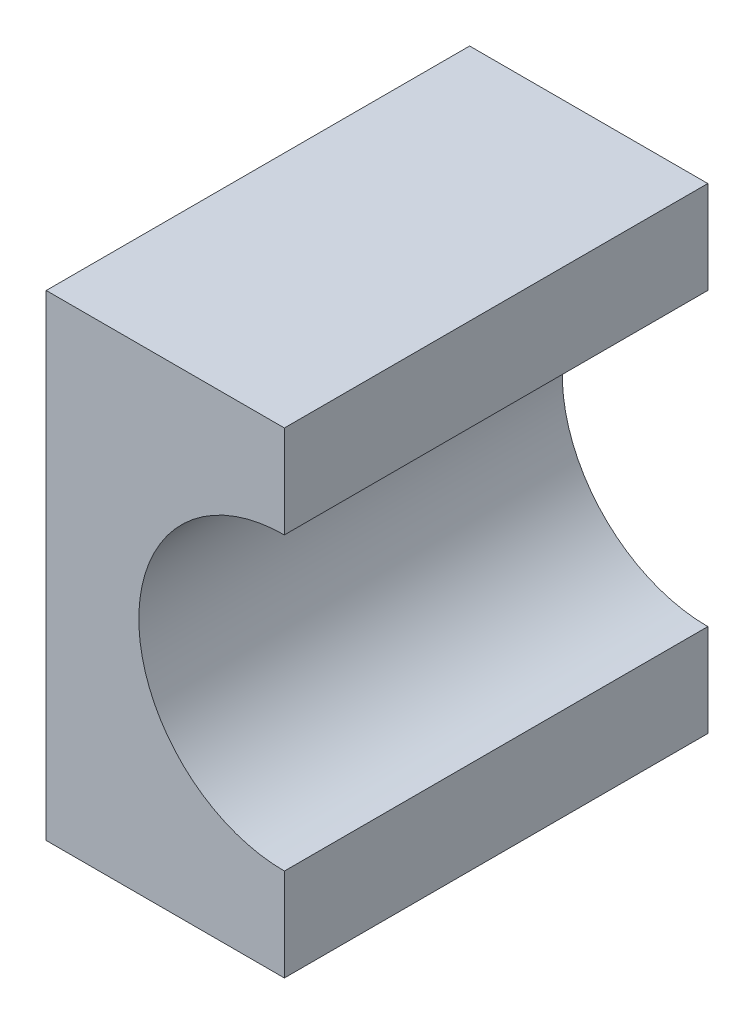
ISO-10303-21;
HEADER;
FILE_DESCRIPTION(('STEP AP214'),'2;1');
FILE_NAME('part.step','',(''),(''),'','','');
FILE_SCHEMA(('AUTOMOTIVE_DESIGN { 1 0 10303 214 1 1 1 1 }'));
ENDSEC;
DATA;
#1=APPLICATION_CONTEXT('core data for automotive mechanical design processes');
#2=APPLICATION_PROTOCOL_DEFINITION('international standard','automotive_design',2000,#1);
#3=PRODUCT_CONTEXT('',#1,'mechanical');
#4=PRODUCT('Part','Part','',(#3));
#5=PRODUCT_RELATED_PRODUCT_CATEGORY('part','',(#4));
#6=PRODUCT_DEFINITION_FORMATION('','',#4);
#7=PRODUCT_DEFINITION_CONTEXT('part definition',#1,'design');
#8=PRODUCT_DEFINITION('design','',#6,#7);
#9=PRODUCT_DEFINITION_SHAPE('','',#8);
#10=(LENGTH_UNIT() NAMED_UNIT(*) SI_UNIT(.MILLI.,.METRE.));
#11=(NAMED_UNIT(*) PLANE_ANGLE_UNIT() SI_UNIT($,.RADIAN.));
#12=(NAMED_UNIT(*) SI_UNIT($,.STERADIAN.) SOLID_ANGLE_UNIT());
#13=UNCERTAINTY_MEASURE_WITH_UNIT(LENGTH_MEASURE(1.E-05),#10,'distance_accuracy_value','');
#14=(GEOMETRIC_REPRESENTATION_CONTEXT(3) GLOBAL_UNCERTAINTY_ASSIGNED_CONTEXT((#13)) GLOBAL_UNIT_ASSIGNED_CONTEXT((#10,
#11,#12)) REPRESENTATION_CONTEXT('',''));
#15=CARTESIAN_POINT('',(0.,0.,0.));
#16=DIRECTION('',(0.,0.,1.));
#17=DIRECTION('',(1.,0.,0.));
#18=AXIS2_PLACEMENT_3D('',#15,#16,#17);
#19=CARTESIAN_POINT('',(9.,-8.55,0.));
#20=DIRECTION('',(-1.,0.,0.));
#21=DIRECTION('',(0.,0.,1.));
#22=AXIS2_PLACEMENT_3D('',#19,#20,#21);
#23=PLANE('',#22);
#24=DIRECTION('',(0.,0.,-1.));
#25=VECTOR('',#24,1.);
#26=CARTESIAN_POINT('',(9.,-8.375,0.));
#27=LINE('',#26,#25);
#28=CARTESIAN_POINT('',(9.,-8.375,0.));
#29=VERTEX_POINT('',#28);
#30=CARTESIAN_POINT('',(9.,-8.375,0.8));
#31=VERTEX_POINT('',#30);
#32=EDGE_CURVE('E86',#29,#31,#27,.F.);
#33=ORIENTED_EDGE('',*,*,#32,.T.);
#34=DIRECTION('',(0.,1.,0.));
#35=VECTOR('',#34,1.);
#36=CARTESIAN_POINT('',(9.,-8.1,0.8));
#37=LINE('',#36,#35);
#38=CARTESIAN_POINT('',(9.,-8.55,0.8));
#39=VERTEX_POINT('',#38);
#40=EDGE_CURVE('E67',#39,#31,#37,.T.);
#41=ORIENTED_EDGE('',*,*,#40,.F.);
#42=DIRECTION('',(0.,0.,1.));
#43=VECTOR('',#42,1.);
#44=CARTESIAN_POINT('',(9.,-8.55,0.));
#45=LINE('',#44,#43);
#46=CARTESIAN_POINT('',(9.,-8.55,0.));
#47=VERTEX_POINT('',#46);
#48=EDGE_CURVE('E91',#39,#47,#45,.F.);
#49=ORIENTED_EDGE('',*,*,#48,.T.);
#50=DIRECTION('',(0.,1.,0.));
#51=VECTOR('',#50,1.);
#52=CARTESIAN_POINT('',(9.,-8.1,0.));
#53=LINE('',#52,#51);
#54=EDGE_CURVE('E110',#47,#29,#53,.T.);
#55=ORIENTED_EDGE('',*,*,#54,.T.);
#56=EDGE_LOOP('',(#33,#41,#49,#55));
#57=FACE_BOUND('',#56,.T.);
#58=ADVANCED_FACE('F17',(#57),#23,.F.);
#59=CARTESIAN_POINT('',(9.,-8.1,0.));
#60=DIRECTION('',(0.,0.,-1.));
#61=DIRECTION('',(-1.,0.,0.));
#62=AXIS2_PLACEMENT_3D('',#59,#60,#61);
#63=CYLINDRICAL_SURFACE('',#62,0.275);
#64=CARTESIAN_POINT('',(9.,-8.1,0.8));
#65=DIRECTION('',(0.,0.,-1.));
#66=DIRECTION('',(-1.,0.,0.));
#67=AXIS2_PLACEMENT_3D('',#64,#65,#66);
#68=CIRCLE('',#67,0.275);
#69=CARTESIAN_POINT('',(9.,-7.825,0.8));
#70=VERTEX_POINT('',#69);
#71=EDGE_CURVE('E20',#31,#70,#68,.T.);
#72=ORIENTED_EDGE('',*,*,#71,.F.);
#73=ORIENTED_EDGE('',*,*,#32,.F.);
#74=CARTESIAN_POINT('',(9.,-8.1,0.));
#75=DIRECTION('',(0.,0.,-1.));
#76=DIRECTION('',(-1.,0.,0.));
#77=AXIS2_PLACEMENT_3D('',#74,#75,#76);
#78=CIRCLE('',#77,0.275);
#79=CARTESIAN_POINT('',(9.,-7.825,0.));
#80=VERTEX_POINT('',#79);
#81=EDGE_CURVE('E81',#29,#80,#78,.T.);
#82=ORIENTED_EDGE('',*,*,#81,.T.);
#83=DIRECTION('',(0.,0.,1.));
#84=VECTOR('',#83,1.);
#85=CARTESIAN_POINT('',(9.,-7.825,0.));
#86=LINE('',#85,#84);
#87=EDGE_CURVE('E78',#80,#70,#86,.T.);
#88=ORIENTED_EDGE('',*,*,#87,.T.);
#89=EDGE_LOOP('',(#72,#73,#82,#88));
#90=FACE_BOUND('',#89,.T.);
#91=ADVANCED_FACE('F79',(#90),#63,.F.);
#92=CARTESIAN_POINT('',(9.,-7.825,0.));
#93=DIRECTION('',(-1.,0.,0.));
#94=DIRECTION('',(0.,0.,1.));
#95=AXIS2_PLACEMENT_3D('',#92,#93,#94);
#96=PLANE('',#95);
#97=DIRECTION('',(0.,0.,-1.));
#98=VECTOR('',#97,1.);
#99=CARTESIAN_POINT('',(9.,-7.65,0.));
#100=LINE('',#99,#98);
#101=CARTESIAN_POINT('',(9.,-7.65,0.));
#102=VERTEX_POINT('',#101);
#103=CARTESIAN_POINT('',(9.,-7.65,0.8));
#104=VERTEX_POINT('',#103);
#105=EDGE_CURVE('E85',#102,#104,#100,.F.);
#106=ORIENTED_EDGE('',*,*,#105,.T.);
#107=DIRECTION('',(0.,1.,0.));
#108=VECTOR('',#107,1.);
#109=CARTESIAN_POINT('',(9.,-8.1,0.8));
#110=LINE('',#109,#108);
#111=EDGE_CURVE('E74',#70,#104,#110,.T.);
#112=ORIENTED_EDGE('',*,*,#111,.F.);
#113=ORIENTED_EDGE('',*,*,#87,.F.);
#114=DIRECTION('',(0.,1.,0.));
#115=VECTOR('',#114,1.);
#116=CARTESIAN_POINT('',(9.,-8.1,0.));
#117=LINE('',#116,#115);
#118=EDGE_CURVE('E129',#80,#102,#117,.T.);
#119=ORIENTED_EDGE('',*,*,#118,.T.);
#120=EDGE_LOOP('',(#106,#112,#113,#119));
#121=FACE_BOUND('',#120,.T.);
#122=ADVANCED_FACE('F88',(#121),#96,.F.);
#123=CARTESIAN_POINT('',(9.,-7.65,0.));
#124=DIRECTION('',(0.,-1.,0.));
#125=DIRECTION('',(0.,0.,-1.));
#126=AXIS2_PLACEMENT_3D('',#123,#124,#125);
#127=PLANE('',#126);
#128=DIRECTION('',(0.,0.,-1.));
#129=VECTOR('',#128,1.);
#130=CARTESIAN_POINT('',(8.55,-7.65,0.));
#131=LINE('',#130,#129);
#132=CARTESIAN_POINT('',(8.55,-7.65,0.));
#133=VERTEX_POINT('',#132);
#134=CARTESIAN_POINT('',(8.55,-7.65,0.8));
#135=VERTEX_POINT('',#134);
#136=EDGE_CURVE('E126',#133,#135,#131,.F.);
#137=ORIENTED_EDGE('',*,*,#136,.T.);
#138=DIRECTION('',(1.,0.,0.));
#139=VECTOR('',#138,1.);
#140=CARTESIAN_POINT('',(8.751769296698,-7.65,0.8));
#141=LINE('',#140,#139);
#142=EDGE_CURVE('E100',#104,#135,#141,.F.);
#143=ORIENTED_EDGE('',*,*,#142,.F.);
#144=ORIENTED_EDGE('',*,*,#105,.F.);
#145=DIRECTION('',(1.,0.,0.));
#146=VECTOR('',#145,1.);
#147=CARTESIAN_POINT('',(8.751769296698,-7.65,0.));
#148=LINE('',#147,#146);
#149=EDGE_CURVE('E103',#102,#133,#148,.F.);
#150=ORIENTED_EDGE('',*,*,#149,.T.);
#151=EDGE_LOOP('',(#137,#143,#144,#150));
#152=FACE_BOUND('',#151,.T.);
#153=ADVANCED_FACE('F154',(#152),#127,.F.);
#154=CARTESIAN_POINT('',(8.751769296698,-8.1,0.8));
#155=DIRECTION('',(0.,0.,1.));
#156=DIRECTION('',(1.,0.,0.));
#157=AXIS2_PLACEMENT_3D('',#154,#155,#156);
#158=PLANE('',#157);
#159=ORIENTED_EDGE('',*,*,#71,.T.);
#160=ORIENTED_EDGE('',*,*,#111,.T.);
#161=ORIENTED_EDGE('',*,*,#142,.T.);
#162=DIRECTION('',(0.,1.,0.));
#163=VECTOR('',#162,1.);
#164=CARTESIAN_POINT('',(8.55,-7.65,0.8));
#165=LINE('',#164,#163);
#166=CARTESIAN_POINT('',(8.55,-8.55,0.8));
#167=VERTEX_POINT('',#166);
#168=EDGE_CURVE('E120',#135,#167,#165,.F.);
#169=ORIENTED_EDGE('',*,*,#168,.T.);
#170=DIRECTION('',(1.,0.,0.));
#171=VECTOR('',#170,1.);
#172=CARTESIAN_POINT('',(8.55,-8.55,0.8));
#173=LINE('',#172,#171);
#174=EDGE_CURVE('E89',#167,#39,#173,.T.);
#175=ORIENTED_EDGE('',*,*,#174,.T.);
#176=ORIENTED_EDGE('',*,*,#40,.T.);
#177=EDGE_LOOP('',(#159,#160,#161,#169,#175,#176));
#178=FACE_BOUND('',#177,.T.);
#179=ADVANCED_FACE('F72',(#178),#158,.T.);
#180=CARTESIAN_POINT('',(8.55,-8.55,0.));
#181=DIRECTION('',(0.,1.,0.));
#182=DIRECTION('',(0.,0.,1.));
#183=AXIS2_PLACEMENT_3D('',#180,#181,#182);
#184=PLANE('',#183);
#185=ORIENTED_EDGE('',*,*,#48,.F.);
#186=ORIENTED_EDGE('',*,*,#174,.F.);
#187=DIRECTION('',(0.,0.,-1.));
#188=VECTOR('',#187,1.);
#189=CARTESIAN_POINT('',(8.55,-8.55,0.));
#190=LINE('',#189,#188);
#191=CARTESIAN_POINT('',(8.55,-8.55,0.));
#192=VERTEX_POINT('',#191);
#193=EDGE_CURVE('E26',#167,#192,#190,.T.);
#194=ORIENTED_EDGE('',*,*,#193,.T.);
#195=DIRECTION('',(1.,0.,0.));
#196=VECTOR('',#195,1.);
#197=CARTESIAN_POINT('',(8.751769296698,-8.55,0.));
#198=LINE('',#197,#196);
#199=EDGE_CURVE('E34',#192,#47,#198,.T.);
#200=ORIENTED_EDGE('',*,*,#199,.T.);
#201=EDGE_LOOP('',(#185,#186,#194,#200));
#202=FACE_BOUND('',#201,.T.);
#203=ADVANCED_FACE('F148',(#202),#184,.F.);
#204=CARTESIAN_POINT('',(8.751769296698,-8.1,0.));
#205=DIRECTION('',(0.,0.,1.));
#206=DIRECTION('',(1.,0.,0.));
#207=AXIS2_PLACEMENT_3D('',#204,#205,#206);
#208=PLANE('',#207);
#209=ORIENTED_EDGE('',*,*,#81,.F.);
#210=ORIENTED_EDGE('',*,*,#54,.F.);
#211=ORIENTED_EDGE('',*,*,#199,.F.);
#212=DIRECTION('',(0.,1.,0.));
#213=VECTOR('',#212,1.);
#214=CARTESIAN_POINT('',(8.55,-7.65,0.));
#215=LINE('',#214,#213);
#216=EDGE_CURVE('E11',#192,#133,#215,.T.);
#217=ORIENTED_EDGE('',*,*,#216,.T.);
#218=ORIENTED_EDGE('',*,*,#149,.F.);
#219=ORIENTED_EDGE('',*,*,#118,.F.);
#220=EDGE_LOOP('',(#209,#210,#211,#217,#218,#219));
#221=FACE_BOUND('',#220,.T.);
#222=ADVANCED_FACE('F146',(#221),#208,.F.);
#223=CARTESIAN_POINT('',(8.55,-7.65,0.));
#224=DIRECTION('',(1.,0.,0.));
#225=DIRECTION('',(0.,0.,-1.));
#226=AXIS2_PLACEMENT_3D('',#223,#224,#225);
#227=PLANE('',#226);
#228=ORIENTED_EDGE('',*,*,#193,.F.);
#229=ORIENTED_EDGE('',*,*,#168,.F.);
#230=ORIENTED_EDGE('',*,*,#136,.F.);
#231=ORIENTED_EDGE('',*,*,#216,.F.);
#232=EDGE_LOOP('',(#228,#229,#230,#231));
#233=FACE_BOUND('',#232,.T.);
#234=ADVANCED_FACE('F152',(#233),#227,.F.);
#235=CLOSED_SHELL('',(#58,#91,#122,#153,#179,#203,#222,#234));
#236=MANIFOLD_SOLID_BREP('B1',#235);
#237=ADVANCED_BREP_SHAPE_REPRESENTATION('',(#18,#236),#14);
#238=SHAPE_DEFINITION_REPRESENTATION(#9,#237);
ENDSEC;
END-ISO-10303-21;
